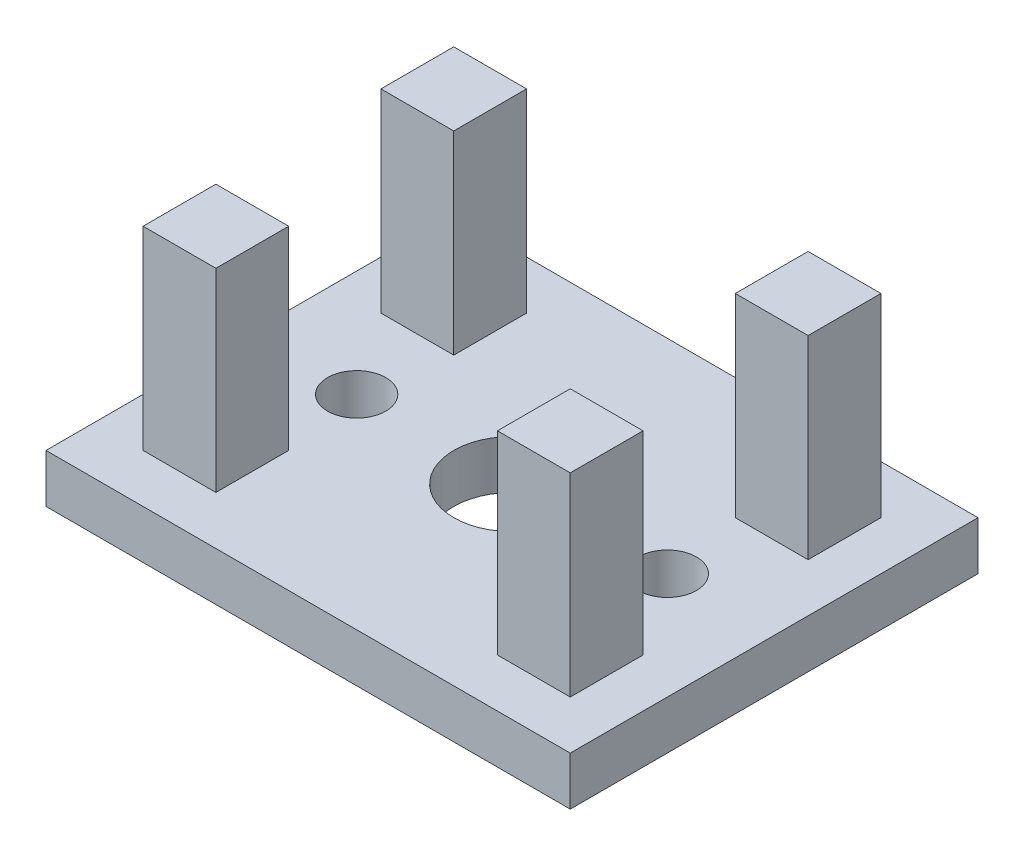
ISO-10303-21;
HEADER;
FILE_DESCRIPTION(('STEP AP214'),'2;1');
FILE_NAME('part.step','',(''),(''),'','','');
FILE_SCHEMA(('AUTOMOTIVE_DESIGN { 1 0 10303 214 1 1 1 1 }'));
ENDSEC;
DATA;
#1=APPLICATION_CONTEXT('core data for automotive mechanical design processes');
#2=APPLICATION_PROTOCOL_DEFINITION('international standard','automotive_design',2000,#1);
#3=PRODUCT_CONTEXT('',#1,'mechanical');
#4=PRODUCT('Part','Part','',(#3));
#5=PRODUCT_RELATED_PRODUCT_CATEGORY('part','',(#4));
#6=PRODUCT_DEFINITION_FORMATION('','',#4);
#7=PRODUCT_DEFINITION_CONTEXT('part definition',#1,'design');
#8=PRODUCT_DEFINITION('design','',#6,#7);
#9=PRODUCT_DEFINITION_SHAPE('','',#8);
#10=(LENGTH_UNIT() NAMED_UNIT(*) SI_UNIT(.MILLI.,.METRE.));
#11=(NAMED_UNIT(*) PLANE_ANGLE_UNIT() SI_UNIT($,.RADIAN.));
#12=(NAMED_UNIT(*) SI_UNIT($,.STERADIAN.) SOLID_ANGLE_UNIT());
#13=UNCERTAINTY_MEASURE_WITH_UNIT(LENGTH_MEASURE(1.E-05),#10,'distance_accuracy_value','');
#14=(GEOMETRIC_REPRESENTATION_CONTEXT(3) GLOBAL_UNCERTAINTY_ASSIGNED_CONTEXT((#13)) GLOBAL_UNIT_ASSIGNED_CONTEXT((#10,
#11,#12)) REPRESENTATION_CONTEXT('',''));
#15=CARTESIAN_POINT('',(0.,0.,0.));
#16=DIRECTION('',(0.,0.,1.));
#17=DIRECTION('',(1.,0.,0.));
#18=AXIS2_PLACEMENT_3D('',#15,#16,#17);
#19=CARTESIAN_POINT('',(0.,5.,0.));
#20=DIRECTION('',(0.,1.,0.));
#21=DIRECTION('',(0.,0.,1.));
#22=AXIS2_PLACEMENT_3D('',#19,#20,#21);
#23=PLANE('',#22);
#24=DIRECTION('',(0.,0.,-1.));
#25=VECTOR('',#24,1.);
#26=CARTESIAN_POINT('',(-22.,5.,0.));
#27=LINE('',#26,#25);
#28=CARTESIAN_POINT('',(-22.,5.,16.));
#29=VERTEX_POINT('',#28);
#30=CARTESIAN_POINT('',(-22.,5.,8.49999999999999));
#31=VERTEX_POINT('',#30);
#32=EDGE_CURVE('E198',#29,#31,#27,.T.);
#33=ORIENTED_EDGE('',*,*,#32,.T.);
#34=DIRECTION('',(1.,0.,0.));
#35=VECTOR('',#34,1.);
#36=CARTESIAN_POINT('',(0.,5.,8.49999999999999));
#37=LINE('',#36,#35);
#38=CARTESIAN_POINT('',(-14.5,5.,8.49999999999999));
#39=VERTEX_POINT('',#38);
#40=EDGE_CURVE('E210',#31,#39,#37,.T.);
#41=ORIENTED_EDGE('',*,*,#40,.T.);
#42=DIRECTION('',(0.,0.,-1.));
#43=VECTOR('',#42,1.);
#44=CARTESIAN_POINT('',(-14.5,5.,0.));
#45=LINE('',#44,#43);
#46=CARTESIAN_POINT('',(-14.5,5.,16.));
#47=VERTEX_POINT('',#46);
#48=EDGE_CURVE('E220',#47,#39,#45,.T.);
#49=ORIENTED_EDGE('',*,*,#48,.F.);
#50=DIRECTION('',(1.,0.,0.));
#51=VECTOR('',#50,1.);
#52=CARTESIAN_POINT('',(0.,5.,16.));
#53=LINE('',#52,#51);
#54=EDGE_CURVE('E200',#29,#47,#53,.T.);
#55=ORIENTED_EDGE('',*,*,#54,.F.);
#56=EDGE_LOOP('',(#33,#41,#49,#55));
#57=FACE_BOUND('',#56,.T.);
#58=DIRECTION('',(0.,0.,1.));
#59=VECTOR('',#58,1.);
#60=CARTESIAN_POINT('',(22.,5.,0.));
#61=LINE('',#60,#59);
#62=CARTESIAN_POINT('',(22.,5.,-16.));
#63=VERTEX_POINT('',#62);
#64=CARTESIAN_POINT('',(22.,5.,-8.50000000000001));
#65=VERTEX_POINT('',#64);
#66=EDGE_CURVE('E235',#63,#65,#61,.T.);
#67=ORIENTED_EDGE('',*,*,#66,.T.);
#68=DIRECTION('',(-1.,0.,0.));
#69=VECTOR('',#68,1.);
#70=CARTESIAN_POINT('',(0.,5.,-8.5));
#71=LINE('',#70,#69);
#72=CARTESIAN_POINT('',(14.5,5.,-8.50000000000001));
#73=VERTEX_POINT('',#72);
#74=EDGE_CURVE('E240',#65,#73,#71,.T.);
#75=ORIENTED_EDGE('',*,*,#74,.T.);
#76=DIRECTION('',(0.,0.,1.));
#77=VECTOR('',#76,1.);
#78=CARTESIAN_POINT('',(14.5,5.,0.));
#79=LINE('',#78,#77);
#80=CARTESIAN_POINT('',(14.5,5.,-16.));
#81=VERTEX_POINT('',#80);
#82=EDGE_CURVE('E252',#81,#73,#79,.T.);
#83=ORIENTED_EDGE('',*,*,#82,.F.);
#84=DIRECTION('',(-1.,0.,0.));
#85=VECTOR('',#84,1.);
#86=CARTESIAN_POINT('',(0.,5.,-16.));
#87=LINE('',#86,#85);
#88=EDGE_CURVE('E249',#63,#81,#87,.T.);
#89=ORIENTED_EDGE('',*,*,#88,.F.);
#90=EDGE_LOOP('',(#67,#75,#83,#89));
#91=FACE_BOUND('',#90,.T.);
#92=DIRECTION('',(0.,0.,1.));
#93=VECTOR('',#92,1.);
#94=CARTESIAN_POINT('',(-14.5,5.,0.));
#95=LINE('',#94,#93);
#96=CARTESIAN_POINT('',(-14.5,5.,-16.));
#97=VERTEX_POINT('',#96);
#98=CARTESIAN_POINT('',(-14.5,5.,-8.5));
#99=VERTEX_POINT('',#98);
#100=EDGE_CURVE('E267',#97,#99,#95,.T.);
#101=ORIENTED_EDGE('',*,*,#100,.T.);
#102=DIRECTION('',(1.,0.,0.));
#103=VECTOR('',#102,1.);
#104=CARTESIAN_POINT('',(0.,5.,-8.5));
#105=LINE('',#104,#103);
#106=CARTESIAN_POINT('',(-22.,5.,-8.5));
#107=VERTEX_POINT('',#106);
#108=EDGE_CURVE('E272',#107,#99,#105,.T.);
#109=ORIENTED_EDGE('',*,*,#108,.F.);
#110=DIRECTION('',(0.,0.,1.));
#111=VECTOR('',#110,1.);
#112=CARTESIAN_POINT('',(-22.,5.,0.));
#113=LINE('',#112,#111);
#114=CARTESIAN_POINT('',(-22.,5.,-16.));
#115=VERTEX_POINT('',#114);
#116=EDGE_CURVE('E285',#115,#107,#113,.T.);
#117=ORIENTED_EDGE('',*,*,#116,.F.);
#118=DIRECTION('',(1.,0.,0.));
#119=VECTOR('',#118,1.);
#120=CARTESIAN_POINT('',(0.,5.,-16.));
#121=LINE('',#120,#119);
#122=EDGE_CURVE('E282',#115,#97,#121,.T.);
#123=ORIENTED_EDGE('',*,*,#122,.T.);
#124=EDGE_LOOP('',(#101,#109,#117,#123));
#125=FACE_BOUND('',#124,.T.);
#126=CARTESIAN_POINT('',(16.,5.,0.));
#127=DIRECTION('',(0.,1.,0.));
#128=DIRECTION('',(0.,0.,1.));
#129=AXIS2_PLACEMENT_3D('',#126,#127,#128);
#130=CIRCLE('',#129,3.);
#131=CARTESIAN_POINT('',(16.,5.,3.));
#132=VERTEX_POINT('',#131);
#133=EDGE_CURVE('E297',#132,#132,#130,.T.);
#134=ORIENTED_EDGE('',*,*,#133,.F.);
#135=EDGE_LOOP('',(#134));
#136=FACE_BOUND('',#135,.T.);
#137=CARTESIAN_POINT('',(-16.,5.,0.));
#138=DIRECTION('',(0.,1.,0.));
#139=DIRECTION('',(0.,0.,1.));
#140=AXIS2_PLACEMENT_3D('',#137,#138,#139);
#141=CIRCLE('',#140,3.);
#142=CARTESIAN_POINT('',(-16.,5.,3.));
#143=VERTEX_POINT('',#142);
#144=EDGE_CURVE('E302',#143,#143,#141,.T.);
#145=ORIENTED_EDGE('',*,*,#144,.F.);
#146=EDGE_LOOP('',(#145));
#147=FACE_BOUND('',#146,.T.);
#148=CARTESIAN_POINT('',(0.,5.,0.));
#149=DIRECTION('',(0.,1.,0.));
#150=DIRECTION('',(0.,0.,1.));
#151=AXIS2_PLACEMENT_3D('',#148,#149,#150);
#152=CIRCLE('',#151,6.);
#153=CARTESIAN_POINT('',(0.,5.,6.));
#154=VERTEX_POINT('',#153);
#155=EDGE_CURVE('E301',#154,#154,#152,.T.);
#156=ORIENTED_EDGE('',*,*,#155,.F.);
#157=EDGE_LOOP('',(#156));
#158=FACE_BOUND('',#157,.T.);
#159=DIRECTION('',(0.,0.,1.));
#160=VECTOR('',#159,1.);
#161=CARTESIAN_POINT('',(-27.,5.,-21.));
#162=LINE('',#161,#160);
#163=CARTESIAN_POINT('',(-27.,5.,-21.));
#164=VERTEX_POINT('',#163);
#165=CARTESIAN_POINT('',(-27.,5.,21.));
#166=VERTEX_POINT('',#165);
#167=EDGE_CURVE('E316',#164,#166,#162,.T.);
#168=ORIENTED_EDGE('',*,*,#167,.T.);
#169=DIRECTION('',(1.,0.,0.));
#170=VECTOR('',#169,1.);
#171=CARTESIAN_POINT('',(-27.,5.,21.));
#172=LINE('',#171,#170);
#173=CARTESIAN_POINT('',(27.,5.,21.));
#174=VERTEX_POINT('',#173);
#175=EDGE_CURVE('E319',#166,#174,#172,.T.);
#176=ORIENTED_EDGE('',*,*,#175,.T.);
#177=DIRECTION('',(0.,0.,-1.));
#178=VECTOR('',#177,1.);
#179=CARTESIAN_POINT('',(27.,5.,-21.));
#180=LINE('',#179,#178);
#181=CARTESIAN_POINT('',(27.,5.,-21.));
#182=VERTEX_POINT('',#181);
#183=EDGE_CURVE('E322',#174,#182,#180,.T.);
#184=ORIENTED_EDGE('',*,*,#183,.T.);
#185=DIRECTION('',(-1.,0.,0.));
#186=VECTOR('',#185,1.);
#187=CARTESIAN_POINT('',(-27.,5.,-21.));
#188=LINE('',#187,#186);
#189=EDGE_CURVE('E324',#182,#164,#188,.T.);
#190=ORIENTED_EDGE('',*,*,#189,.T.);
#191=EDGE_LOOP('',(#168,#176,#184,#190));
#192=FACE_BOUND('',#191,.T.);
#193=DIRECTION('',(-1.,0.,0.));
#194=VECTOR('',#193,1.);
#195=CARTESIAN_POINT('',(0.,5.,8.5));
#196=LINE('',#195,#194);
#197=CARTESIAN_POINT('',(22.,5.,8.50000000000001));
#198=VERTEX_POINT('',#197);
#199=CARTESIAN_POINT('',(14.5,5.,8.50000000000001));
#200=VERTEX_POINT('',#199);
#201=EDGE_CURVE('E54',#198,#200,#196,.T.);
#202=ORIENTED_EDGE('',*,*,#201,.F.);
#203=DIRECTION('',(0.,0.,-1.));
#204=VECTOR('',#203,1.);
#205=CARTESIAN_POINT('',(22.,5.,0.));
#206=LINE('',#205,#204);
#207=CARTESIAN_POINT('',(22.,5.,16.));
#208=VERTEX_POINT('',#207);
#209=EDGE_CURVE('E197',#208,#198,#206,.T.);
#210=ORIENTED_EDGE('',*,*,#209,.F.);
#211=DIRECTION('',(-1.,0.,0.));
#212=VECTOR('',#211,1.);
#213=CARTESIAN_POINT('',(0.,5.,16.));
#214=LINE('',#213,#212);
#215=CARTESIAN_POINT('',(14.5,5.,16.));
#216=VERTEX_POINT('',#215);
#217=EDGE_CURVE('E194',#208,#216,#214,.T.);
#218=ORIENTED_EDGE('',*,*,#217,.T.);
#219=DIRECTION('',(0.,0.,-1.));
#220=VECTOR('',#219,1.);
#221=CARTESIAN_POINT('',(14.5,5.,0.));
#222=LINE('',#221,#220);
#223=EDGE_CURVE('E59',#216,#200,#222,.T.);
#224=ORIENTED_EDGE('',*,*,#223,.T.);
#225=EDGE_LOOP('',(#202,#210,#218,#224));
#226=FACE_BOUND('',#225,.T.);
#227=ADVANCED_FACE('F39',(#57,#91,#125,#136,#147,#158,#192,#226),#23,.T.);
#228=CARTESIAN_POINT('',(-27.,5.,-21.));
#229=DIRECTION('',(1.,0.,0.));
#230=DIRECTION('',(0.,0.,-1.));
#231=AXIS2_PLACEMENT_3D('',#228,#229,#230);
#232=PLANE('',#231);
#233=DIRECTION('',(0.,0.,1.));
#234=VECTOR('',#233,1.);
#235=CARTESIAN_POINT('',(-27.,0.,-21.));
#236=LINE('',#235,#234);
#237=CARTESIAN_POINT('',(-27.,0.,-21.));
#238=VERTEX_POINT('',#237);
#239=CARTESIAN_POINT('',(-27.,0.,21.));
#240=VERTEX_POINT('',#239);
#241=EDGE_CURVE('E313',#238,#240,#236,.T.);
#242=ORIENTED_EDGE('',*,*,#241,.T.);
#243=DIRECTION('',(0.,-1.,0.));
#244=VECTOR('',#243,1.);
#245=CARTESIAN_POINT('',(-27.,5.,21.));
#246=LINE('',#245,#244);
#247=EDGE_CURVE('E11',#166,#240,#246,.T.);
#248=ORIENTED_EDGE('',*,*,#247,.F.);
#249=ORIENTED_EDGE('',*,*,#167,.F.);
#250=DIRECTION('',(0.,-1.,0.));
#251=VECTOR('',#250,1.);
#252=CARTESIAN_POINT('',(-27.,5.,-21.));
#253=LINE('',#252,#251);
#254=EDGE_CURVE('E326',#164,#238,#253,.T.);
#255=ORIENTED_EDGE('',*,*,#254,.T.);
#256=EDGE_LOOP('',(#242,#248,#249,#255));
#257=FACE_BOUND('',#256,.T.);
#258=ADVANCED_FACE('F41',(#257),#232,.F.);
#259=CARTESIAN_POINT('',(-27.,5.,21.));
#260=DIRECTION('',(0.,0.,-1.));
#261=DIRECTION('',(-1.,0.,0.));
#262=AXIS2_PLACEMENT_3D('',#259,#260,#261);
#263=PLANE('',#262);
#264=DIRECTION('',(1.,0.,0.));
#265=VECTOR('',#264,1.);
#266=CARTESIAN_POINT('',(-27.,0.,21.));
#267=LINE('',#266,#265);
#268=CARTESIAN_POINT('',(27.,0.,21.));
#269=VERTEX_POINT('',#268);
#270=EDGE_CURVE('E329',#240,#269,#267,.T.);
#271=ORIENTED_EDGE('',*,*,#270,.T.);
#272=DIRECTION('',(0.,-1.,0.));
#273=VECTOR('',#272,1.);
#274=CARTESIAN_POINT('',(27.,5.,21.));
#275=LINE('',#274,#273);
#276=EDGE_CURVE('E47',#174,#269,#275,.T.);
#277=ORIENTED_EDGE('',*,*,#276,.F.);
#278=ORIENTED_EDGE('',*,*,#175,.F.);
#279=ORIENTED_EDGE('',*,*,#247,.T.);
#280=EDGE_LOOP('',(#271,#277,#278,#279));
#281=FACE_BOUND('',#280,.T.);
#282=ADVANCED_FACE('F358',(#281),#263,.F.);
#283=CARTESIAN_POINT('',(27.,5.,-21.));
#284=DIRECTION('',(-1.,0.,0.));
#285=DIRECTION('',(0.,0.,1.));
#286=AXIS2_PLACEMENT_3D('',#283,#284,#285);
#287=PLANE('',#286);
#288=DIRECTION('',(0.,0.,-1.));
#289=VECTOR('',#288,1.);
#290=CARTESIAN_POINT('',(27.,0.,-21.));
#291=LINE('',#290,#289);
#292=CARTESIAN_POINT('',(27.,0.,-21.));
#293=VERTEX_POINT('',#292);
#294=EDGE_CURVE('E331',#269,#293,#291,.T.);
#295=ORIENTED_EDGE('',*,*,#294,.T.);
#296=DIRECTION('',(0.,-1.,0.));
#297=VECTOR('',#296,1.);
#298=CARTESIAN_POINT('',(27.,5.,-21.));
#299=LINE('',#298,#297);
#300=EDGE_CURVE('E336',#182,#293,#299,.T.);
#301=ORIENTED_EDGE('',*,*,#300,.F.);
#302=ORIENTED_EDGE('',*,*,#183,.F.);
#303=ORIENTED_EDGE('',*,*,#276,.T.);
#304=EDGE_LOOP('',(#295,#301,#302,#303));
#305=FACE_BOUND('',#304,.T.);
#306=ADVANCED_FACE('F343',(#305),#287,.F.);
#307=CARTESIAN_POINT('',(-27.,5.,-21.));
#308=DIRECTION('',(0.,0.,1.));
#309=DIRECTION('',(1.,0.,0.));
#310=AXIS2_PLACEMENT_3D('',#307,#308,#309);
#311=PLANE('',#310);
#312=DIRECTION('',(-1.,0.,0.));
#313=VECTOR('',#312,1.);
#314=CARTESIAN_POINT('',(-27.,0.,-21.));
#315=LINE('',#314,#313);
#316=EDGE_CURVE('E320',#293,#238,#315,.T.);
#317=ORIENTED_EDGE('',*,*,#316,.T.);
#318=ORIENTED_EDGE('',*,*,#254,.F.);
#319=ORIENTED_EDGE('',*,*,#189,.F.);
#320=ORIENTED_EDGE('',*,*,#300,.T.);
#321=EDGE_LOOP('',(#317,#318,#319,#320));
#322=FACE_BOUND('',#321,.T.);
#323=ADVANCED_FACE('F352',(#322),#311,.F.);
#324=CARTESIAN_POINT('',(0.,0.,0.));
#325=DIRECTION('',(0.,1.,0.));
#326=DIRECTION('',(0.,0.,1.));
#327=AXIS2_PLACEMENT_3D('',#324,#325,#326);
#328=PLANE('',#327);
#329=CARTESIAN_POINT('',(16.,0.,0.));
#330=DIRECTION('',(0.,1.,0.));
#331=DIRECTION('',(0.,0.,1.));
#332=AXIS2_PLACEMENT_3D('',#329,#330,#331);
#333=CIRCLE('',#332,3.);
#334=CARTESIAN_POINT('',(16.,0.,3.));
#335=VERTEX_POINT('',#334);
#336=EDGE_CURVE('E305',#335,#335,#333,.T.);
#337=ORIENTED_EDGE('',*,*,#336,.T.);
#338=EDGE_LOOP('',(#337));
#339=FACE_BOUND('',#338,.T.);
#340=CARTESIAN_POINT('',(-16.,0.,0.));
#341=DIRECTION('',(0.,1.,0.));
#342=DIRECTION('',(0.,0.,1.));
#343=AXIS2_PLACEMENT_3D('',#340,#341,#342);
#344=CIRCLE('',#343,3.);
#345=CARTESIAN_POINT('',(-16.,0.,3.));
#346=VERTEX_POINT('',#345);
#347=EDGE_CURVE('E298',#346,#346,#344,.T.);
#348=ORIENTED_EDGE('',*,*,#347,.T.);
#349=EDGE_LOOP('',(#348));
#350=FACE_BOUND('',#349,.T.);
#351=CARTESIAN_POINT('',(0.,0.,0.));
#352=DIRECTION('',(0.,1.,0.));
#353=DIRECTION('',(0.,0.,1.));
#354=AXIS2_PLACEMENT_3D('',#351,#352,#353);
#355=CIRCLE('',#354,6.);
#356=CARTESIAN_POINT('',(0.,0.,6.));
#357=VERTEX_POINT('',#356);
#358=EDGE_CURVE('E310',#357,#357,#355,.T.);
#359=ORIENTED_EDGE('',*,*,#358,.T.);
#360=EDGE_LOOP('',(#359));
#361=FACE_BOUND('',#360,.T.);
#362=ORIENTED_EDGE('',*,*,#241,.F.);
#363=ORIENTED_EDGE('',*,*,#316,.F.);
#364=ORIENTED_EDGE('',*,*,#294,.F.);
#365=ORIENTED_EDGE('',*,*,#270,.F.);
#366=EDGE_LOOP('',(#362,#363,#364,#365));
#367=FACE_BOUND('',#366,.T.);
#368=ADVANCED_FACE('F349',(#339,#350,#361,#367),#328,.F.);
#369=CARTESIAN_POINT('',(0.,0.,0.));
#370=DIRECTION('',(0.,1.,0.));
#371=DIRECTION('',(0.,0.,1.));
#372=AXIS2_PLACEMENT_3D('',#369,#370,#371);
#373=CYLINDRICAL_SURFACE('',#372,6.);
#374=ORIENTED_EDGE('',*,*,#358,.F.);
#375=EDGE_LOOP('',(#374));
#376=FACE_BOUND('',#375,.T.);
#377=ORIENTED_EDGE('',*,*,#155,.T.);
#378=EDGE_LOOP('',(#377));
#379=FACE_BOUND('',#378,.T.);
#380=ADVANCED_FACE('F375',(#376,#379),#373,.F.);
#381=CARTESIAN_POINT('',(-16.,0.,0.));
#382=DIRECTION('',(0.,1.,0.));
#383=DIRECTION('',(0.,0.,1.));
#384=AXIS2_PLACEMENT_3D('',#381,#382,#383);
#385=CYLINDRICAL_SURFACE('',#384,3.);
#386=ORIENTED_EDGE('',*,*,#347,.F.);
#387=EDGE_LOOP('',(#386));
#388=FACE_BOUND('',#387,.T.);
#389=ORIENTED_EDGE('',*,*,#144,.T.);
#390=EDGE_LOOP('',(#389));
#391=FACE_BOUND('',#390,.T.);
#392=ADVANCED_FACE('F391',(#388,#391),#385,.F.);
#393=CARTESIAN_POINT('',(16.,0.,0.));
#394=DIRECTION('',(0.,1.,0.));
#395=DIRECTION('',(0.,0.,1.));
#396=AXIS2_PLACEMENT_3D('',#393,#394,#395);
#397=CYLINDRICAL_SURFACE('',#396,3.);
#398=ORIENTED_EDGE('',*,*,#336,.F.);
#399=EDGE_LOOP('',(#398));
#400=FACE_BOUND('',#399,.T.);
#401=ORIENTED_EDGE('',*,*,#133,.T.);
#402=EDGE_LOOP('',(#401));
#403=FACE_BOUND('',#402,.T.);
#404=ADVANCED_FACE('F396',(#400,#403),#397,.F.);
#405=CARTESIAN_POINT('',(-14.5,25.,0.));
#406=DIRECTION('',(1.,0.,0.));
#407=DIRECTION('',(0.,0.,-1.));
#408=AXIS2_PLACEMENT_3D('',#405,#406,#407);
#409=PLANE('',#408);
#410=ORIENTED_EDGE('',*,*,#100,.F.);
#411=DIRECTION('',(0.,-1.,0.));
#412=VECTOR('',#411,1.);
#413=CARTESIAN_POINT('',(-14.5,25.,-16.));
#414=LINE('',#413,#412);
#415=CARTESIAN_POINT('',(-14.5,25.,-16.));
#416=VERTEX_POINT('',#415);
#417=EDGE_CURVE('E295',#416,#97,#414,.T.);
#418=ORIENTED_EDGE('',*,*,#417,.F.);
#419=DIRECTION('',(0.,0.,1.));
#420=VECTOR('',#419,1.);
#421=CARTESIAN_POINT('',(-14.5,25.,0.));
#422=LINE('',#421,#420);
#423=CARTESIAN_POINT('',(-14.5,25.,-8.5));
#424=VERTEX_POINT('',#423);
#425=EDGE_CURVE('E268',#416,#424,#422,.T.);
#426=ORIENTED_EDGE('',*,*,#425,.T.);
#427=DIRECTION('',(0.,-1.,0.));
#428=VECTOR('',#427,1.);
#429=CARTESIAN_POINT('',(-14.5,25.,-8.5));
#430=LINE('',#429,#428);
#431=EDGE_CURVE('E279',#424,#99,#430,.T.);
#432=ORIENTED_EDGE('',*,*,#431,.T.);
#433=EDGE_LOOP('',(#410,#418,#426,#432));
#434=FACE_BOUND('',#433,.T.);
#435=ADVANCED_FACE('F454',(#434),#409,.T.);
#436=CARTESIAN_POINT('',(0.,25.,-16.));
#437=DIRECTION('',(0.,0.,-1.));
#438=DIRECTION('',(-1.,0.,0.));
#439=AXIS2_PLACEMENT_3D('',#436,#437,#438);
#440=PLANE('',#439);
#441=ORIENTED_EDGE('',*,*,#122,.F.);
#442=DIRECTION('',(0.,-1.,0.));
#443=VECTOR('',#442,1.);
#444=CARTESIAN_POINT('',(-22.,25.,-16.));
#445=LINE('',#444,#443);
#446=CARTESIAN_POINT('',(-22.,25.,-16.));
#447=VERTEX_POINT('',#446);
#448=EDGE_CURVE('E293',#447,#115,#445,.T.);
#449=ORIENTED_EDGE('',*,*,#448,.F.);
#450=DIRECTION('',(1.,0.,0.));
#451=VECTOR('',#450,1.);
#452=CARTESIAN_POINT('',(0.,25.,-16.));
#453=LINE('',#452,#451);
#454=EDGE_CURVE('E271',#447,#416,#453,.T.);
#455=ORIENTED_EDGE('',*,*,#454,.T.);
#456=ORIENTED_EDGE('',*,*,#417,.T.);
#457=EDGE_LOOP('',(#441,#449,#455,#456));
#458=FACE_BOUND('',#457,.T.);
#459=ADVANCED_FACE('F459',(#458),#440,.T.);
#460=CARTESIAN_POINT('',(-22.,25.,0.));
#461=DIRECTION('',(1.,0.,0.));
#462=DIRECTION('',(0.,0.,-1.));
#463=AXIS2_PLACEMENT_3D('',#460,#461,#462);
#464=PLANE('',#463);
#465=ORIENTED_EDGE('',*,*,#116,.T.);
#466=DIRECTION('',(0.,-1.,0.));
#467=VECTOR('',#466,1.);
#468=CARTESIAN_POINT('',(-22.,25.,-8.5));
#469=LINE('',#468,#467);
#470=CARTESIAN_POINT('',(-22.,25.,-8.5));
#471=VERTEX_POINT('',#470);
#472=EDGE_CURVE('E291',#471,#107,#469,.T.);
#473=ORIENTED_EDGE('',*,*,#472,.F.);
#474=DIRECTION('',(0.,0.,1.));
#475=VECTOR('',#474,1.);
#476=CARTESIAN_POINT('',(-22.,25.,0.));
#477=LINE('',#476,#475);
#478=EDGE_CURVE('E275',#447,#471,#477,.T.);
#479=ORIENTED_EDGE('',*,*,#478,.F.);
#480=ORIENTED_EDGE('',*,*,#448,.T.);
#481=EDGE_LOOP('',(#465,#473,#479,#480));
#482=FACE_BOUND('',#481,.T.);
#483=ADVANCED_FACE('F585',(#482),#464,.F.);
#484=CARTESIAN_POINT('',(0.,25.,-8.5));
#485=DIRECTION('',(0.,0.,-1.));
#486=DIRECTION('',(-1.,0.,0.));
#487=AXIS2_PLACEMENT_3D('',#484,#485,#486);
#488=PLANE('',#487);
#489=ORIENTED_EDGE('',*,*,#108,.T.);
#490=ORIENTED_EDGE('',*,*,#431,.F.);
#491=DIRECTION('',(1.,0.,0.));
#492=VECTOR('',#491,1.);
#493=CARTESIAN_POINT('',(0.,25.,-8.5));
#494=LINE('',#493,#492);
#495=EDGE_CURVE('E277',#471,#424,#494,.T.);
#496=ORIENTED_EDGE('',*,*,#495,.F.);
#497=ORIENTED_EDGE('',*,*,#472,.T.);
#498=EDGE_LOOP('',(#489,#490,#496,#497));
#499=FACE_BOUND('',#498,.T.);
#500=ADVANCED_FACE('F619',(#499),#488,.F.);
#501=CARTESIAN_POINT('',(0.,25.,0.));
#502=DIRECTION('',(0.,1.,0.));
#503=DIRECTION('',(0.,0.,1.));
#504=AXIS2_PLACEMENT_3D('',#501,#502,#503);
#505=PLANE('',#504);
#506=ORIENTED_EDGE('',*,*,#425,.F.);
#507=ORIENTED_EDGE('',*,*,#454,.F.);
#508=ORIENTED_EDGE('',*,*,#478,.T.);
#509=ORIENTED_EDGE('',*,*,#495,.T.);
#510=EDGE_LOOP('',(#506,#507,#508,#509));
#511=FACE_BOUND('',#510,.T.);
#512=ADVANCED_FACE('F512',(#511),#505,.T.);
#513=CARTESIAN_POINT('',(22.,25.,0.));
#514=DIRECTION('',(1.,0.,0.));
#515=DIRECTION('',(0.,0.,-1.));
#516=AXIS2_PLACEMENT_3D('',#513,#514,#515);
#517=PLANE('',#516);
#518=ORIENTED_EDGE('',*,*,#66,.F.);
#519=DIRECTION('',(0.,-1.,0.));
#520=VECTOR('',#519,1.);
#521=CARTESIAN_POINT('',(22.,25.,-16.));
#522=LINE('',#521,#520);
#523=CARTESIAN_POINT('',(22.,25.,-16.));
#524=VERTEX_POINT('',#523);
#525=EDGE_CURVE('E264',#524,#63,#522,.T.);
#526=ORIENTED_EDGE('',*,*,#525,.F.);
#527=DIRECTION('',(0.,0.,1.));
#528=VECTOR('',#527,1.);
#529=CARTESIAN_POINT('',(22.,25.,0.));
#530=LINE('',#529,#528);
#531=CARTESIAN_POINT('',(22.,25.,-8.50000000000001));
#532=VERTEX_POINT('',#531);
#533=EDGE_CURVE('E236',#524,#532,#530,.T.);
#534=ORIENTED_EDGE('',*,*,#533,.T.);
#535=DIRECTION('',(0.,-1.,0.));
#536=VECTOR('',#535,1.);
#537=CARTESIAN_POINT('',(22.,25.,-8.50000000000001));
#538=LINE('',#537,#536);
#539=EDGE_CURVE('E247',#532,#65,#538,.T.);
#540=ORIENTED_EDGE('',*,*,#539,.T.);
#541=EDGE_LOOP('',(#518,#526,#534,#540));
#542=FACE_BOUND('',#541,.T.);
#543=ADVANCED_FACE('F506',(#542),#517,.T.);
#544=CARTESIAN_POINT('',(0.,25.,-16.));
#545=DIRECTION('',(0.,0.,1.));
#546=DIRECTION('',(1.,0.,0.));
#547=AXIS2_PLACEMENT_3D('',#544,#545,#546);
#548=PLANE('',#547);
#549=ORIENTED_EDGE('',*,*,#88,.T.);
#550=DIRECTION('',(0.,-1.,0.));
#551=VECTOR('',#550,1.);
#552=CARTESIAN_POINT('',(14.5,25.,-16.));
#553=LINE('',#552,#551);
#554=CARTESIAN_POINT('',(14.5,25.,-16.));
#555=VERTEX_POINT('',#554);
#556=EDGE_CURVE('E261',#555,#81,#553,.T.);
#557=ORIENTED_EDGE('',*,*,#556,.F.);
#558=DIRECTION('',(-1.,0.,0.));
#559=VECTOR('',#558,1.);
#560=CARTESIAN_POINT('',(0.,25.,-16.));
#561=LINE('',#560,#559);
#562=EDGE_CURVE('E239',#524,#555,#561,.T.);
#563=ORIENTED_EDGE('',*,*,#562,.F.);
#564=ORIENTED_EDGE('',*,*,#525,.T.);
#565=EDGE_LOOP('',(#549,#557,#563,#564));
#566=FACE_BOUND('',#565,.T.);
#567=ADVANCED_FACE('F511',(#566),#548,.F.);
#568=CARTESIAN_POINT('',(14.5,25.,0.));
#569=DIRECTION('',(1.,0.,0.));
#570=DIRECTION('',(0.,0.,-1.));
#571=AXIS2_PLACEMENT_3D('',#568,#569,#570);
#572=PLANE('',#571);
#573=ORIENTED_EDGE('',*,*,#82,.T.);
#574=DIRECTION('',(0.,-1.,0.));
#575=VECTOR('',#574,1.);
#576=CARTESIAN_POINT('',(14.5,25.,-8.50000000000001));
#577=LINE('',#576,#575);
#578=CARTESIAN_POINT('',(14.5,25.,-8.50000000000001));
#579=VERTEX_POINT('',#578);
#580=EDGE_CURVE('E258',#579,#73,#577,.T.);
#581=ORIENTED_EDGE('',*,*,#580,.F.);
#582=DIRECTION('',(0.,0.,1.));
#583=VECTOR('',#582,1.);
#584=CARTESIAN_POINT('',(14.5,25.,0.));
#585=LINE('',#584,#583);
#586=EDGE_CURVE('E242',#555,#579,#585,.T.);
#587=ORIENTED_EDGE('',*,*,#586,.F.);
#588=ORIENTED_EDGE('',*,*,#556,.T.);
#589=EDGE_LOOP('',(#573,#581,#587,#588));
#590=FACE_BOUND('',#589,.T.);
#591=ADVANCED_FACE('F524',(#590),#572,.F.);
#592=CARTESIAN_POINT('',(0.,25.,-8.5));
#593=DIRECTION('',(0.,0.,1.));
#594=DIRECTION('',(1.,0.,0.));
#595=AXIS2_PLACEMENT_3D('',#592,#593,#594);
#596=PLANE('',#595);
#597=ORIENTED_EDGE('',*,*,#74,.F.);
#598=ORIENTED_EDGE('',*,*,#539,.F.);
#599=DIRECTION('',(-1.,0.,0.));
#600=VECTOR('',#599,1.);
#601=CARTESIAN_POINT('',(0.,25.,-8.5));
#602=LINE('',#601,#600);
#603=EDGE_CURVE('E244',#532,#579,#602,.T.);
#604=ORIENTED_EDGE('',*,*,#603,.T.);
#605=ORIENTED_EDGE('',*,*,#580,.T.);
#606=EDGE_LOOP('',(#597,#598,#604,#605));
#607=FACE_BOUND('',#606,.T.);
#608=ADVANCED_FACE('F498',(#607),#596,.T.);
#609=CARTESIAN_POINT('',(0.,25.,0.));
#610=DIRECTION('',(0.,1.,0.));
#611=DIRECTION('',(0.,0.,1.));
#612=AXIS2_PLACEMENT_3D('',#609,#610,#611);
#613=PLANE('',#612);
#614=ORIENTED_EDGE('',*,*,#533,.F.);
#615=ORIENTED_EDGE('',*,*,#562,.T.);
#616=ORIENTED_EDGE('',*,*,#586,.T.);
#617=ORIENTED_EDGE('',*,*,#603,.F.);
#618=EDGE_LOOP('',(#614,#615,#616,#617));
#619=FACE_BOUND('',#618,.T.);
#620=ADVANCED_FACE('F412',(#619),#613,.T.);
#621=CARTESIAN_POINT('',(-22.,25.,0.));
#622=DIRECTION('',(-1.,0.,0.));
#623=DIRECTION('',(0.,0.,1.));
#624=AXIS2_PLACEMENT_3D('',#621,#622,#623);
#625=PLANE('',#624);
#626=ORIENTED_EDGE('',*,*,#32,.F.);
#627=DIRECTION('',(0.,-1.,0.));
#628=VECTOR('',#627,1.);
#629=CARTESIAN_POINT('',(-22.,25.,16.));
#630=LINE('',#629,#628);
#631=CARTESIAN_POINT('',(-22.,25.,16.));
#632=VERTEX_POINT('',#631);
#633=EDGE_CURVE('E232',#632,#29,#630,.T.);
#634=ORIENTED_EDGE('',*,*,#633,.F.);
#635=DIRECTION('',(0.,0.,-1.));
#636=VECTOR('',#635,1.);
#637=CARTESIAN_POINT('',(-22.,25.,0.));
#638=LINE('',#637,#636);
#639=CARTESIAN_POINT('',(-22.,25.,8.49999999999999));
#640=VERTEX_POINT('',#639);
#641=EDGE_CURVE('E206',#632,#640,#638,.T.);
#642=ORIENTED_EDGE('',*,*,#641,.T.);
#643=DIRECTION('',(0.,-1.,0.));
#644=VECTOR('',#643,1.);
#645=CARTESIAN_POINT('',(-22.,25.,8.49999999999999));
#646=LINE('',#645,#644);
#647=EDGE_CURVE('E216',#640,#31,#646,.T.);
#648=ORIENTED_EDGE('',*,*,#647,.T.);
#649=EDGE_LOOP('',(#626,#634,#642,#648));
#650=FACE_BOUND('',#649,.T.);
#651=ADVANCED_FACE('F406',(#650),#625,.T.);
#652=CARTESIAN_POINT('',(0.,25.,16.));
#653=DIRECTION('',(0.,0.,-1.));
#654=DIRECTION('',(-1.,0.,0.));
#655=AXIS2_PLACEMENT_3D('',#652,#653,#654);
#656=PLANE('',#655);
#657=ORIENTED_EDGE('',*,*,#54,.T.);
#658=DIRECTION('',(0.,-1.,0.));
#659=VECTOR('',#658,1.);
#660=CARTESIAN_POINT('',(-14.5,25.,16.));
#661=LINE('',#660,#659);
#662=CARTESIAN_POINT('',(-14.5,25.,16.));
#663=VERTEX_POINT('',#662);
#664=EDGE_CURVE('E229',#663,#47,#661,.T.);
#665=ORIENTED_EDGE('',*,*,#664,.F.);
#666=DIRECTION('',(1.,0.,0.));
#667=VECTOR('',#666,1.);
#668=CARTESIAN_POINT('',(0.,25.,16.));
#669=LINE('',#668,#667);
#670=EDGE_CURVE('E209',#632,#663,#669,.T.);
#671=ORIENTED_EDGE('',*,*,#670,.F.);
#672=ORIENTED_EDGE('',*,*,#633,.T.);
#673=EDGE_LOOP('',(#657,#665,#671,#672));
#674=FACE_BOUND('',#673,.T.);
#675=ADVANCED_FACE('F411',(#674),#656,.F.);
#676=CARTESIAN_POINT('',(-14.5,25.,0.));
#677=DIRECTION('',(-1.,0.,0.));
#678=DIRECTION('',(0.,0.,1.));
#679=AXIS2_PLACEMENT_3D('',#676,#677,#678);
#680=PLANE('',#679);
#681=ORIENTED_EDGE('',*,*,#48,.T.);
#682=DIRECTION('',(0.,-1.,0.));
#683=VECTOR('',#682,1.);
#684=CARTESIAN_POINT('',(-14.5,25.,8.49999999999999));
#685=LINE('',#684,#683);
#686=CARTESIAN_POINT('',(-14.5,25.,8.49999999999999));
#687=VERTEX_POINT('',#686);
#688=EDGE_CURVE('E226',#687,#39,#685,.T.);
#689=ORIENTED_EDGE('',*,*,#688,.F.);
#690=DIRECTION('',(0.,0.,-1.));
#691=VECTOR('',#690,1.);
#692=CARTESIAN_POINT('',(-14.5,25.,0.));
#693=LINE('',#692,#691);
#694=EDGE_CURVE('E212',#663,#687,#693,.T.);
#695=ORIENTED_EDGE('',*,*,#694,.F.);
#696=ORIENTED_EDGE('',*,*,#664,.T.);
#697=EDGE_LOOP('',(#681,#689,#695,#696));
#698=FACE_BOUND('',#697,.T.);
#699=ADVANCED_FACE('F424',(#698),#680,.F.);
#700=CARTESIAN_POINT('',(0.,25.,8.49999999999999));
#701=DIRECTION('',(0.,0.,-1.));
#702=DIRECTION('',(-1.,0.,0.));
#703=AXIS2_PLACEMENT_3D('',#700,#701,#702);
#704=PLANE('',#703);
#705=ORIENTED_EDGE('',*,*,#40,.F.);
#706=ORIENTED_EDGE('',*,*,#647,.F.);
#707=DIRECTION('',(1.,0.,0.));
#708=VECTOR('',#707,1.);
#709=CARTESIAN_POINT('',(0.,25.,8.49999999999999));
#710=LINE('',#709,#708);
#711=EDGE_CURVE('E214',#640,#687,#710,.T.);
#712=ORIENTED_EDGE('',*,*,#711,.T.);
#713=ORIENTED_EDGE('',*,*,#688,.T.);
#714=EDGE_LOOP('',(#705,#706,#712,#713));
#715=FACE_BOUND('',#714,.T.);
#716=ADVANCED_FACE('F437',(#715),#704,.T.);
#717=CARTESIAN_POINT('',(0.,25.,0.));
#718=DIRECTION('',(0.,1.,0.));
#719=DIRECTION('',(0.,0.,1.));
#720=AXIS2_PLACEMENT_3D('',#717,#718,#719);
#721=PLANE('',#720);
#722=ORIENTED_EDGE('',*,*,#641,.F.);
#723=ORIENTED_EDGE('',*,*,#670,.T.);
#724=ORIENTED_EDGE('',*,*,#694,.T.);
#725=ORIENTED_EDGE('',*,*,#711,.F.);
#726=EDGE_LOOP('',(#722,#723,#724,#725));
#727=FACE_BOUND('',#726,.T.);
#728=ADVANCED_FACE('F432',(#727),#721,.T.);
#729=CARTESIAN_POINT('',(22.,25.,0.));
#730=DIRECTION('',(-1.,0.,0.));
#731=DIRECTION('',(0.,0.,1.));
#732=AXIS2_PLACEMENT_3D('',#729,#730,#731);
#733=PLANE('',#732);
#734=ORIENTED_EDGE('',*,*,#209,.T.);
#735=DIRECTION('',(0.,-1.,0.));
#736=VECTOR('',#735,1.);
#737=CARTESIAN_POINT('',(22.,25.,8.50000000000001));
#738=LINE('',#737,#736);
#739=CARTESIAN_POINT('',(22.,25.,8.50000000000001));
#740=VERTEX_POINT('',#739);
#741=EDGE_CURVE('E178',#740,#198,#738,.T.);
#742=ORIENTED_EDGE('',*,*,#741,.F.);
#743=DIRECTION('',(0.,0.,-1.));
#744=VECTOR('',#743,1.);
#745=CARTESIAN_POINT('',(22.,25.,0.));
#746=LINE('',#745,#744);
#747=CARTESIAN_POINT('',(22.,25.,16.));
#748=VERTEX_POINT('',#747);
#749=EDGE_CURVE('E185',#748,#740,#746,.T.);
#750=ORIENTED_EDGE('',*,*,#749,.F.);
#751=DIRECTION('',(0.,-1.,0.));
#752=VECTOR('',#751,1.);
#753=CARTESIAN_POINT('',(22.,25.,16.));
#754=LINE('',#753,#752);
#755=EDGE_CURVE('E737',#748,#208,#754,.T.);
#756=ORIENTED_EDGE('',*,*,#755,.T.);
#757=EDGE_LOOP('',(#734,#742,#750,#756));
#758=FACE_BOUND('',#757,.T.);
#759=ADVANCED_FACE('F196',(#758),#733,.F.);
#760=CARTESIAN_POINT('',(0.,25.,8.5));
#761=DIRECTION('',(0.,0.,1.));
#762=DIRECTION('',(1.,0.,0.));
#763=AXIS2_PLACEMENT_3D('',#760,#761,#762);
#764=PLANE('',#763);
#765=ORIENTED_EDGE('',*,*,#201,.T.);
#766=DIRECTION('',(0.,-1.,0.));
#767=VECTOR('',#766,1.);
#768=CARTESIAN_POINT('',(14.5,25.,8.50000000000001));
#769=LINE('',#768,#767);
#770=CARTESIAN_POINT('',(14.5,25.,8.50000000000001));
#771=VERTEX_POINT('',#770);
#772=EDGE_CURVE('E180',#771,#200,#769,.T.);
#773=ORIENTED_EDGE('',*,*,#772,.F.);
#774=DIRECTION('',(-1.,0.,0.));
#775=VECTOR('',#774,1.);
#776=CARTESIAN_POINT('',(0.,25.,8.5));
#777=LINE('',#776,#775);
#778=EDGE_CURVE('E174',#740,#771,#777,.T.);
#779=ORIENTED_EDGE('',*,*,#778,.F.);
#780=ORIENTED_EDGE('',*,*,#741,.T.);
#781=EDGE_LOOP('',(#765,#773,#779,#780));
#782=FACE_BOUND('',#781,.T.);
#783=ADVANCED_FACE('F176',(#782),#764,.F.);
#784=CARTESIAN_POINT('',(14.5,25.,0.));
#785=DIRECTION('',(-1.,0.,0.));
#786=DIRECTION('',(0.,0.,1.));
#787=AXIS2_PLACEMENT_3D('',#784,#785,#786);
#788=PLANE('',#787);
#789=ORIENTED_EDGE('',*,*,#223,.F.);
#790=DIRECTION('',(0.,-1.,0.));
#791=VECTOR('',#790,1.);
#792=CARTESIAN_POINT('',(14.5,25.,16.));
#793=LINE('',#792,#791);
#794=CARTESIAN_POINT('',(14.5,25.,16.));
#795=VERTEX_POINT('',#794);
#796=EDGE_CURVE('E202',#795,#216,#793,.T.);
#797=ORIENTED_EDGE('',*,*,#796,.F.);
#798=DIRECTION('',(0.,0.,-1.));
#799=VECTOR('',#798,1.);
#800=CARTESIAN_POINT('',(14.5,25.,0.));
#801=LINE('',#800,#799);
#802=EDGE_CURVE('E184',#795,#771,#801,.T.);
#803=ORIENTED_EDGE('',*,*,#802,.T.);
#804=ORIENTED_EDGE('',*,*,#772,.T.);
#805=EDGE_LOOP('',(#789,#797,#803,#804));
#806=FACE_BOUND('',#805,.T.);
#807=ADVANCED_FACE('F472',(#806),#788,.T.);
#808=CARTESIAN_POINT('',(0.,25.,16.));
#809=DIRECTION('',(0.,0.,1.));
#810=DIRECTION('',(1.,0.,0.));
#811=AXIS2_PLACEMENT_3D('',#808,#809,#810);
#812=PLANE('',#811);
#813=ORIENTED_EDGE('',*,*,#217,.F.);
#814=ORIENTED_EDGE('',*,*,#755,.F.);
#815=DIRECTION('',(-1.,0.,0.));
#816=VECTOR('',#815,1.);
#817=CARTESIAN_POINT('',(0.,25.,16.));
#818=LINE('',#817,#816);
#819=EDGE_CURVE('E191',#748,#795,#818,.T.);
#820=ORIENTED_EDGE('',*,*,#819,.T.);
#821=ORIENTED_EDGE('',*,*,#796,.T.);
#822=EDGE_LOOP('',(#813,#814,#820,#821));
#823=FACE_BOUND('',#822,.T.);
#824=ADVANCED_FACE('F467',(#823),#812,.T.);
#825=CARTESIAN_POINT('',(0.,25.,0.));
#826=DIRECTION('',(0.,1.,0.));
#827=DIRECTION('',(0.,0.,1.));
#828=AXIS2_PLACEMENT_3D('',#825,#826,#827);
#829=PLANE('',#828);
#830=ORIENTED_EDGE('',*,*,#749,.T.);
#831=ORIENTED_EDGE('',*,*,#778,.T.);
#832=ORIENTED_EDGE('',*,*,#802,.F.);
#833=ORIENTED_EDGE('',*,*,#819,.F.);
#834=EDGE_LOOP('',(#830,#831,#832,#833));
#835=FACE_BOUND('',#834,.T.);
#836=ADVANCED_FACE('F189',(#835),#829,.T.);
#837=CLOSED_SHELL('',(#227,#258,#282,#306,#323,#368,#380,#392,#404,#435,#459,#483,#500,#512,
#543,#567,#591,#608,#620,#651,#675,#699,#716,#728,#759,#783,#807,#824,#836));
#838=MANIFOLD_SOLID_BREP('B2',#837);
#839=ADVANCED_BREP_SHAPE_REPRESENTATION('',(#18,#838),#14);
#840=SHAPE_DEFINITION_REPRESENTATION(#9,#839);
ENDSEC;
END-ISO-10303-21;
